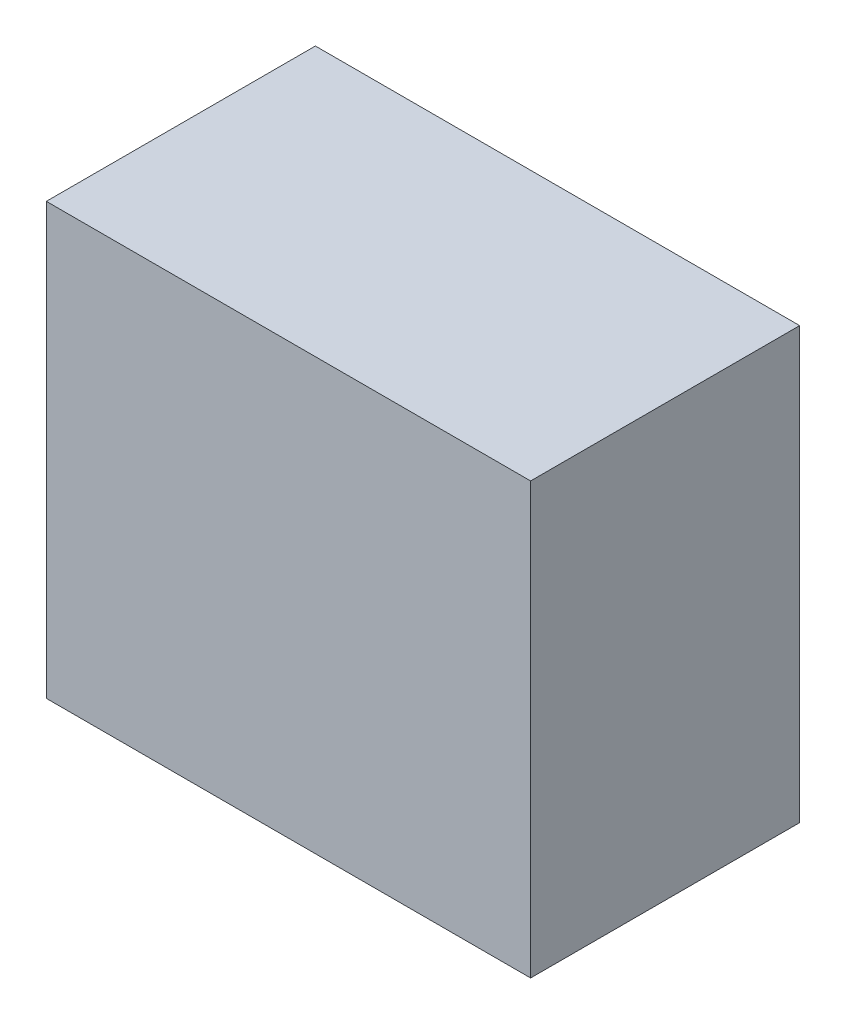
ISO-10303-21;
HEADER;
FILE_DESCRIPTION(('STEP AP214'),'2;1');
FILE_NAME('part.step','',(''),(''),'','','');
FILE_SCHEMA(('AUTOMOTIVE_DESIGN { 1 0 10303 214 1 1 1 1 }'));
ENDSEC;
DATA;
#1=APPLICATION_CONTEXT('core data for automotive mechanical design processes');
#2=APPLICATION_PROTOCOL_DEFINITION('international standard','automotive_design',2000,#1);
#3=PRODUCT_CONTEXT('',#1,'mechanical');
#4=PRODUCT('Part','Part','',(#3));
#5=PRODUCT_RELATED_PRODUCT_CATEGORY('part','',(#4));
#6=PRODUCT_DEFINITION_FORMATION('','',#4);
#7=PRODUCT_DEFINITION_CONTEXT('part definition',#1,'design');
#8=PRODUCT_DEFINITION('design','',#6,#7);
#9=PRODUCT_DEFINITION_SHAPE('','',#8);
#10=(LENGTH_UNIT() NAMED_UNIT(*) SI_UNIT(.MILLI.,.METRE.));
#11=(NAMED_UNIT(*) PLANE_ANGLE_UNIT() SI_UNIT($,.RADIAN.));
#12=(NAMED_UNIT(*) SI_UNIT($,.STERADIAN.) SOLID_ANGLE_UNIT());
#13=UNCERTAINTY_MEASURE_WITH_UNIT(LENGTH_MEASURE(1.E-05),#10,'distance_accuracy_value','');
#14=(GEOMETRIC_REPRESENTATION_CONTEXT(3) GLOBAL_UNCERTAINTY_ASSIGNED_CONTEXT((#13)) GLOBAL_UNIT_ASSIGNED_CONTEXT((#10,
#11,#12)) REPRESENTATION_CONTEXT('',''));
#15=CARTESIAN_POINT('',(0.,0.,0.));
#16=DIRECTION('',(0.,0.,1.));
#17=DIRECTION('',(1.,0.,0.));
#18=AXIS2_PLACEMENT_3D('',#15,#16,#17);
#19=CARTESIAN_POINT('',(730.,1584.,-8.));
#20=DIRECTION('',(-1.,0.,0.));
#21=DIRECTION('',(0.,0.,1.));
#22=AXIS2_PLACEMENT_3D('',#19,#20,#21);
#23=PLANE('',#22);
#24=DIRECTION('',(0.,-1.,0.));
#25=VECTOR('',#24,1.);
#26=CARTESIAN_POINT('',(730.,1584.,2.));
#27=LINE('',#26,#25);
#28=CARTESIAN_POINT('',(730.,1600.,2.));
#29=VERTEX_POINT('',#28);
#30=CARTESIAN_POINT('',(730.,1584.,2.));
#31=VERTEX_POINT('',#30);
#32=EDGE_CURVE('E103',#29,#31,#27,.T.);
#33=ORIENTED_EDGE('',*,*,#32,.F.);
#34=DIRECTION('',(0.,0.,1.));
#35=VECTOR('',#34,1.);
#36=CARTESIAN_POINT('',(730.,1600.,-8.));
#37=LINE('',#36,#35);
#38=CARTESIAN_POINT('',(730.,1600.,-8.));
#39=VERTEX_POINT('',#38);
#40=EDGE_CURVE('E11',#39,#29,#37,.T.);
#41=ORIENTED_EDGE('',*,*,#40,.F.);
#42=DIRECTION('',(0.,-1.,0.));
#43=VECTOR('',#42,1.);
#44=CARTESIAN_POINT('',(730.,1584.,-8.));
#45=LINE('',#44,#43);
#46=CARTESIAN_POINT('',(730.,1584.,-8.));
#47=VERTEX_POINT('',#46);
#48=EDGE_CURVE('E97',#39,#47,#45,.T.);
#49=ORIENTED_EDGE('',*,*,#48,.T.);
#50=DIRECTION('',(0.,0.,1.));
#51=VECTOR('',#50,1.);
#52=CARTESIAN_POINT('',(730.,1584.,-8.));
#53=LINE('',#52,#51);
#54=EDGE_CURVE('E42',#47,#31,#53,.T.);
#55=ORIENTED_EDGE('',*,*,#54,.T.);
#56=EDGE_LOOP('',(#33,#41,#49,#55));
#57=FACE_BOUND('',#56,.T.);
#58=ADVANCED_FACE('F39',(#57),#23,.T.);
#59=CARTESIAN_POINT('',(730.,1600.,-8.));
#60=DIRECTION('',(0.,1.,0.));
#61=DIRECTION('',(0.,0.,1.));
#62=AXIS2_PLACEMENT_3D('',#59,#60,#61);
#63=PLANE('',#62);
#64=DIRECTION('',(-1.,0.,0.));
#65=VECTOR('',#64,1.);
#66=CARTESIAN_POINT('',(730.,1600.,2.));
#67=LINE('',#66,#65);
#68=CARTESIAN_POINT('',(748.,1600.,2.));
#69=VERTEX_POINT('',#68);
#70=EDGE_CURVE('E99',#69,#29,#67,.T.);
#71=ORIENTED_EDGE('',*,*,#70,.F.);
#72=DIRECTION('',(0.,0.,1.));
#73=VECTOR('',#72,1.);
#74=CARTESIAN_POINT('',(748.,1600.,-8.));
#75=LINE('',#74,#73);
#76=CARTESIAN_POINT('',(748.,1600.,-8.));
#77=VERTEX_POINT('',#76);
#78=EDGE_CURVE('E48',#77,#69,#75,.T.);
#79=ORIENTED_EDGE('',*,*,#78,.F.);
#80=DIRECTION('',(-1.,0.,0.));
#81=VECTOR('',#80,1.);
#82=CARTESIAN_POINT('',(730.,1600.,-8.));
#83=LINE('',#82,#81);
#84=EDGE_CURVE('E94',#77,#39,#83,.T.);
#85=ORIENTED_EDGE('',*,*,#84,.T.);
#86=ORIENTED_EDGE('',*,*,#40,.T.);
#87=EDGE_LOOP('',(#71,#79,#85,#86));
#88=FACE_BOUND('',#87,.T.);
#89=ADVANCED_FACE('F113',(#88),#63,.T.);
#90=CARTESIAN_POINT('',(748.,1584.,-8.));
#91=DIRECTION('',(1.,0.,0.));
#92=DIRECTION('',(0.,0.,-1.));
#93=AXIS2_PLACEMENT_3D('',#90,#91,#92);
#94=PLANE('',#93);
#95=DIRECTION('',(0.,1.,0.));
#96=VECTOR('',#95,1.);
#97=CARTESIAN_POINT('',(748.,1584.,2.));
#98=LINE('',#97,#96);
#99=CARTESIAN_POINT('',(748.,1584.,2.));
#100=VERTEX_POINT('',#99);
#101=EDGE_CURVE('E89',#100,#69,#98,.T.);
#102=ORIENTED_EDGE('',*,*,#101,.F.);
#103=DIRECTION('',(0.,0.,1.));
#104=VECTOR('',#103,1.);
#105=CARTESIAN_POINT('',(748.,1584.,-8.));
#106=LINE('',#105,#104);
#107=CARTESIAN_POINT('',(748.,1584.,-8.));
#108=VERTEX_POINT('',#107);
#109=EDGE_CURVE('E84',#108,#100,#106,.T.);
#110=ORIENTED_EDGE('',*,*,#109,.F.);
#111=DIRECTION('',(0.,1.,0.));
#112=VECTOR('',#111,1.);
#113=CARTESIAN_POINT('',(748.,1584.,-8.));
#114=LINE('',#113,#112);
#115=EDGE_CURVE('E87',#108,#77,#114,.T.);
#116=ORIENTED_EDGE('',*,*,#115,.T.);
#117=ORIENTED_EDGE('',*,*,#78,.T.);
#118=EDGE_LOOP('',(#102,#110,#116,#117));
#119=FACE_BOUND('',#118,.T.);
#120=ADVANCED_FACE('F86',(#119),#94,.T.);
#121=CARTESIAN_POINT('',(730.,1584.,-8.));
#122=DIRECTION('',(0.,-1.,0.));
#123=DIRECTION('',(0.,0.,-1.));
#124=AXIS2_PLACEMENT_3D('',#121,#122,#123);
#125=PLANE('',#124);
#126=DIRECTION('',(1.,0.,0.));
#127=VECTOR('',#126,1.);
#128=CARTESIAN_POINT('',(730.,1584.,2.));
#129=LINE('',#128,#127);
#130=EDGE_CURVE('E106',#31,#100,#129,.T.);
#131=ORIENTED_EDGE('',*,*,#130,.F.);
#132=ORIENTED_EDGE('',*,*,#54,.F.);
#133=DIRECTION('',(1.,0.,0.));
#134=VECTOR('',#133,1.);
#135=CARTESIAN_POINT('',(730.,1584.,-8.));
#136=LINE('',#135,#134);
#137=EDGE_CURVE('E93',#47,#108,#136,.T.);
#138=ORIENTED_EDGE('',*,*,#137,.T.);
#139=ORIENTED_EDGE('',*,*,#109,.T.);
#140=EDGE_LOOP('',(#131,#132,#138,#139));
#141=FACE_BOUND('',#140,.T.);
#142=ADVANCED_FACE('F96',(#141),#125,.T.);
#143=CARTESIAN_POINT('',(0.,0.,-8.));
#144=DIRECTION('',(0.,0.,-1.));
#145=DIRECTION('',(-1.,0.,0.));
#146=AXIS2_PLACEMENT_3D('',#143,#144,#145);
#147=PLANE('',#146);
#148=ORIENTED_EDGE('',*,*,#48,.F.);
#149=ORIENTED_EDGE('',*,*,#84,.F.);
#150=ORIENTED_EDGE('',*,*,#115,.F.);
#151=ORIENTED_EDGE('',*,*,#137,.F.);
#152=EDGE_LOOP('',(#148,#149,#150,#151));
#153=FACE_BOUND('',#152,.T.);
#154=ADVANCED_FACE('F92',(#153),#147,.T.);
#155=CARTESIAN_POINT('',(0.,0.,2.));
#156=DIRECTION('',(0.,0.,-1.));
#157=DIRECTION('',(-1.,0.,0.));
#158=AXIS2_PLACEMENT_3D('',#155,#156,#157);
#159=PLANE('',#158);
#160=ORIENTED_EDGE('',*,*,#32,.T.);
#161=ORIENTED_EDGE('',*,*,#130,.T.);
#162=ORIENTED_EDGE('',*,*,#101,.T.);
#163=ORIENTED_EDGE('',*,*,#70,.T.);
#164=EDGE_LOOP('',(#160,#161,#162,#163));
#165=FACE_BOUND('',#164,.T.);
#166=ADVANCED_FACE('F112',(#165),#159,.F.);
#167=CLOSED_SHELL('',(#58,#89,#120,#142,#154,#166));
#168=MANIFOLD_SOLID_BREP('B2',#167);
#169=ADVANCED_BREP_SHAPE_REPRESENTATION('',(#18,#168),#14);
#170=SHAPE_DEFINITION_REPRESENTATION(#9,#169);
ENDSEC;
END-ISO-10303-21;
